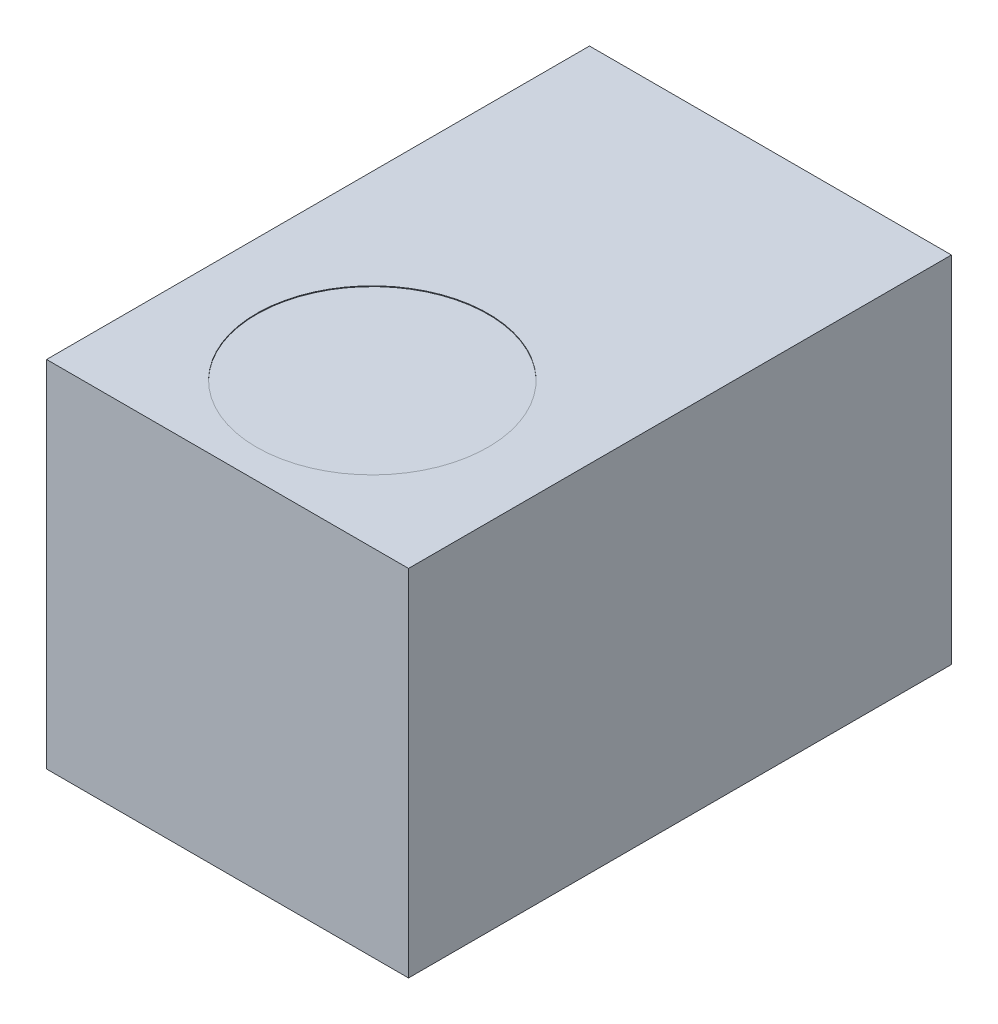
ISO-10303-21;
HEADER;
FILE_DESCRIPTION(('STEP AP214'),'2;1');
FILE_NAME('part.step','',(''),(''),'','','');
FILE_SCHEMA(('AUTOMOTIVE_DESIGN { 1 0 10303 214 1 1 1 1 }'));
ENDSEC;
DATA;
#1=APPLICATION_CONTEXT('core data for automotive mechanical design processes');
#2=APPLICATION_PROTOCOL_DEFINITION('international standard','automotive_design',2000,#1);
#3=PRODUCT_CONTEXT('',#1,'mechanical');
#4=PRODUCT('Part','Part','',(#3));
#5=PRODUCT_RELATED_PRODUCT_CATEGORY('part','',(#4));
#6=PRODUCT_DEFINITION_FORMATION('','',#4);
#7=PRODUCT_DEFINITION_CONTEXT('part definition',#1,'design');
#8=PRODUCT_DEFINITION('design','',#6,#7);
#9=PRODUCT_DEFINITION_SHAPE('','',#8);
#10=(LENGTH_UNIT() NAMED_UNIT(*) SI_UNIT(.MILLI.,.METRE.));
#11=(NAMED_UNIT(*) PLANE_ANGLE_UNIT() SI_UNIT($,.RADIAN.));
#12=(NAMED_UNIT(*) SI_UNIT($,.STERADIAN.) SOLID_ANGLE_UNIT());
#13=UNCERTAINTY_MEASURE_WITH_UNIT(LENGTH_MEASURE(1.E-05),#10,'distance_accuracy_value','');
#14=(GEOMETRIC_REPRESENTATION_CONTEXT(3) GLOBAL_UNCERTAINTY_ASSIGNED_CONTEXT((#13)) GLOBAL_UNIT_ASSIGNED_CONTEXT((#10,
#11,#12)) REPRESENTATION_CONTEXT('',''));
#15=CARTESIAN_POINT('',(0.,0.,0.));
#16=DIRECTION('',(0.,0.,1.));
#17=DIRECTION('',(1.,0.,0.));
#18=AXIS2_PLACEMENT_3D('',#15,#16,#17);
#19=CARTESIAN_POINT('',(50.,24.5,-37.5));
#20=DIRECTION('',(0.,0.,1.));
#21=DIRECTION('',(1.,0.,0.));
#22=AXIS2_PLACEMENT_3D('',#19,#20,#21);
#23=PLANE('',#22);
#24=DIRECTION('',(0.,1.,0.));
#25=VECTOR('',#24,1.);
#26=CARTESIAN_POINT('',(0.,24.5,-37.5));
#27=LINE('',#26,#25);
#28=CARTESIAN_POINT('',(0.,-24.5,-37.5));
#29=VERTEX_POINT('',#28);
#30=CARTESIAN_POINT('',(0.,24.5,-37.5));
#31=VERTEX_POINT('',#30);
#32=EDGE_CURVE('E163',#29,#31,#27,.T.);
#33=ORIENTED_EDGE('',*,*,#32,.T.);
#34=DIRECTION('',(-1.,0.,0.));
#35=VECTOR('',#34,1.);
#36=CARTESIAN_POINT('',(50.,24.5,-37.5));
#37=LINE('',#36,#35);
#38=CARTESIAN_POINT('',(50.,24.5,-37.5));
#39=VERTEX_POINT('',#38);
#40=EDGE_CURVE('E11',#39,#31,#37,.T.);
#41=ORIENTED_EDGE('',*,*,#40,.F.);
#42=DIRECTION('',(0.,1.,0.));
#43=VECTOR('',#42,1.);
#44=CARTESIAN_POINT('',(50.,24.5,-37.5));
#45=LINE('',#44,#43);
#46=CARTESIAN_POINT('',(50.,-24.5,-37.5));
#47=VERTEX_POINT('',#46);
#48=EDGE_CURVE('E169',#47,#39,#45,.T.);
#49=ORIENTED_EDGE('',*,*,#48,.F.);
#50=DIRECTION('',(-1.,0.,0.));
#51=VECTOR('',#50,1.);
#52=CARTESIAN_POINT('',(50.,-24.5,-37.5));
#53=LINE('',#52,#51);
#54=EDGE_CURVE('E179',#47,#29,#53,.T.);
#55=ORIENTED_EDGE('',*,*,#54,.T.);
#56=EDGE_LOOP('',(#33,#41,#49,#55));
#57=FACE_BOUND('',#56,.T.);
#58=ADVANCED_FACE('F40',(#57),#23,.F.);
#59=CARTESIAN_POINT('',(50.,24.5,37.5));
#60=DIRECTION('',(0.,-1.,0.));
#61=DIRECTION('',(0.,0.,-1.));
#62=AXIS2_PLACEMENT_3D('',#59,#60,#61);
#63=PLANE('',#62);
#64=CARTESIAN_POINT('',(25.,24.5,17.5));
#65=DIRECTION('',(0.,1.,0.));
#66=DIRECTION('',(0.,0.,1.));
#67=AXIS2_PLACEMENT_3D('',#64,#65,#66);
#68=CIRCLE('',#67,16.);
#69=CARTESIAN_POINT('',(25.,24.5,33.5));
#70=VERTEX_POINT('',#69);
#71=EDGE_CURVE('E144',#70,#70,#68,.T.);
#72=ORIENTED_EDGE('',*,*,#71,.F.);
#73=EDGE_LOOP('',(#72));
#74=FACE_BOUND('',#73,.T.);
#75=DIRECTION('',(0.,0.,1.));
#76=VECTOR('',#75,1.);
#77=CARTESIAN_POINT('',(0.,24.5,37.5));
#78=LINE('',#77,#76);
#79=CARTESIAN_POINT('',(0.,24.5,37.5));
#80=VERTEX_POINT('',#79);
#81=EDGE_CURVE('E183',#31,#80,#78,.T.);
#82=ORIENTED_EDGE('',*,*,#81,.T.);
#83=DIRECTION('',(-1.,0.,0.));
#84=VECTOR('',#83,1.);
#85=CARTESIAN_POINT('',(50.,24.5,37.5));
#86=LINE('',#85,#84);
#87=CARTESIAN_POINT('',(50.,24.5,37.5));
#88=VERTEX_POINT('',#87);
#89=EDGE_CURVE('E48',#88,#80,#86,.T.);
#90=ORIENTED_EDGE('',*,*,#89,.F.);
#91=DIRECTION('',(0.,0.,1.));
#92=VECTOR('',#91,1.);
#93=CARTESIAN_POINT('',(50.,24.5,37.5));
#94=LINE('',#93,#92);
#95=EDGE_CURVE('E92',#39,#88,#94,.T.);
#96=ORIENTED_EDGE('',*,*,#95,.F.);
#97=ORIENTED_EDGE('',*,*,#40,.T.);
#98=EDGE_LOOP('',(#82,#90,#96,#97));
#99=FACE_BOUND('',#98,.T.);
#100=ADVANCED_FACE('F218',(#74,#99),#63,.F.);
#101=CARTESIAN_POINT('',(50.,24.5,37.5));
#102=DIRECTION('',(0.,0.,-1.));
#103=DIRECTION('',(0.,1.,0.));
#104=AXIS2_PLACEMENT_3D('',#101,#102,#103);
#105=PLANE('',#104);
#106=DIRECTION('',(0.,-1.,0.));
#107=VECTOR('',#106,1.);
#108=CARTESIAN_POINT('',(0.,24.5,37.5));
#109=LINE('',#108,#107);
#110=CARTESIAN_POINT('',(0.,-24.5,37.5));
#111=VERTEX_POINT('',#110);
#112=EDGE_CURVE('E186',#80,#111,#109,.T.);
#113=ORIENTED_EDGE('',*,*,#112,.T.);
#114=DIRECTION('',(-1.,0.,0.));
#115=VECTOR('',#114,1.);
#116=CARTESIAN_POINT('',(50.,-24.5,37.5));
#117=LINE('',#116,#115);
#118=CARTESIAN_POINT('',(50.,-24.5,37.5));
#119=VERTEX_POINT('',#118);
#120=EDGE_CURVE('E193',#119,#111,#117,.T.);
#121=ORIENTED_EDGE('',*,*,#120,.F.);
#122=DIRECTION('',(0.,-1.,0.));
#123=VECTOR('',#122,1.);
#124=CARTESIAN_POINT('',(50.,24.5,37.5));
#125=LINE('',#124,#123);
#126=EDGE_CURVE('E174',#88,#119,#125,.T.);
#127=ORIENTED_EDGE('',*,*,#126,.F.);
#128=ORIENTED_EDGE('',*,*,#89,.T.);
#129=EDGE_LOOP('',(#113,#121,#127,#128));
#130=FACE_BOUND('',#129,.T.);
#131=ADVANCED_FACE('F200',(#130),#105,.F.);
#132=CARTESIAN_POINT('',(50.,-24.5,37.5));
#133=DIRECTION('',(0.,1.,0.));
#134=DIRECTION('',(0.,0.,1.));
#135=AXIS2_PLACEMENT_3D('',#132,#133,#134);
#136=PLANE('',#135);
#137=DIRECTION('',(1.,0.,0.));
#138=VECTOR('',#137,1.);
#139=CARTESIAN_POINT('',(4.99999999999999,-24.5,-16.5));
#140=LINE('',#139,#138);
#141=CARTESIAN_POINT('',(4.99999999999999,-24.5,-16.5));
#142=VERTEX_POINT('',#141);
#143=CARTESIAN_POINT('',(45.,-24.5,-16.5));
#144=VERTEX_POINT('',#143);
#145=EDGE_CURVE('E153',#142,#144,#140,.T.);
#146=ORIENTED_EDGE('',*,*,#145,.F.);
#147=DIRECTION('',(0.,0.,-1.));
#148=VECTOR('',#147,1.);
#149=CARTESIAN_POINT('',(5.,-24.5,35.5));
#150=LINE('',#149,#148);
#151=CARTESIAN_POINT('',(5.,-24.5,35.5));
#152=VERTEX_POINT('',#151);
#153=EDGE_CURVE('E55',#152,#142,#150,.T.);
#154=ORIENTED_EDGE('',*,*,#153,.F.);
#155=DIRECTION('',(-1.,0.,0.));
#156=VECTOR('',#155,1.);
#157=CARTESIAN_POINT('',(5.,-24.5,35.5));
#158=LINE('',#157,#156);
#159=CARTESIAN_POINT('',(45.,-24.5,35.5));
#160=VERTEX_POINT('',#159);
#161=EDGE_CURVE('E137',#160,#152,#158,.T.);
#162=ORIENTED_EDGE('',*,*,#161,.F.);
#163=DIRECTION('',(0.,0.,1.));
#164=VECTOR('',#163,1.);
#165=CARTESIAN_POINT('',(45.,-24.5,35.5));
#166=LINE('',#165,#164);
#167=EDGE_CURVE('E141',#144,#160,#166,.T.);
#168=ORIENTED_EDGE('',*,*,#167,.F.);
#169=EDGE_LOOP('',(#146,#154,#162,#168));
#170=FACE_BOUND('',#169,.T.);
#171=DIRECTION('',(0.,0.,-1.));
#172=VECTOR('',#171,1.);
#173=CARTESIAN_POINT('',(0.,-24.5,37.5));
#174=LINE('',#173,#172);
#175=EDGE_CURVE('E85',#111,#29,#174,.T.);
#176=ORIENTED_EDGE('',*,*,#175,.T.);
#177=ORIENTED_EDGE('',*,*,#54,.F.);
#178=DIRECTION('',(0.,0.,-1.));
#179=VECTOR('',#178,1.);
#180=CARTESIAN_POINT('',(50.,-24.5,37.5));
#181=LINE('',#180,#179);
#182=EDGE_CURVE('E64',#119,#47,#181,.T.);
#183=ORIENTED_EDGE('',*,*,#182,.F.);
#184=ORIENTED_EDGE('',*,*,#120,.T.);
#185=EDGE_LOOP('',(#176,#177,#183,#184));
#186=FACE_BOUND('',#185,.T.);
#187=ADVANCED_FACE('F208',(#170,#186),#136,.F.);
#188=CARTESIAN_POINT('',(50.,0.,0.));
#189=DIRECTION('',(1.,0.,0.));
#190=DIRECTION('',(0.,0.,-1.));
#191=AXIS2_PLACEMENT_3D('',#188,#189,#190);
#192=PLANE('',#191);
#193=ORIENTED_EDGE('',*,*,#48,.T.);
#194=ORIENTED_EDGE('',*,*,#95,.T.);
#195=ORIENTED_EDGE('',*,*,#126,.T.);
#196=ORIENTED_EDGE('',*,*,#182,.T.);
#197=EDGE_LOOP('',(#193,#194,#195,#196));
#198=FACE_BOUND('',#197,.T.);
#199=ADVANCED_FACE('F210',(#198),#192,.T.);
#200=CARTESIAN_POINT('',(0.,0.,0.));
#201=DIRECTION('',(1.,0.,0.));
#202=DIRECTION('',(0.,0.,-1.));
#203=AXIS2_PLACEMENT_3D('',#200,#201,#202);
#204=PLANE('',#203);
#205=ORIENTED_EDGE('',*,*,#32,.F.);
#206=ORIENTED_EDGE('',*,*,#175,.F.);
#207=ORIENTED_EDGE('',*,*,#112,.F.);
#208=ORIENTED_EDGE('',*,*,#81,.F.);
#209=EDGE_LOOP('',(#205,#206,#207,#208));
#210=FACE_BOUND('',#209,.T.);
#211=ADVANCED_FACE('F204',(#210),#204,.F.);
#212=CARTESIAN_POINT('',(5.,15.5,35.5));
#213=DIRECTION('',(-1.,0.,0.));
#214=DIRECTION('',(0.,0.,1.));
#215=AXIS2_PLACEMENT_3D('',#212,#213,#214);
#216=PLANE('',#215);
#217=ORIENTED_EDGE('',*,*,#153,.T.);
#218=DIRECTION('',(0.,-1.,0.));
#219=VECTOR('',#218,1.);
#220=CARTESIAN_POINT('',(4.99999999999999,15.5,-16.5));
#221=LINE('',#220,#219);
#222=CARTESIAN_POINT('',(4.99999999999999,15.5,-16.5));
#223=VERTEX_POINT('',#222);
#224=EDGE_CURVE('E112',#223,#142,#221,.T.);
#225=ORIENTED_EDGE('',*,*,#224,.F.);
#226=DIRECTION('',(0.,0.,-1.));
#227=VECTOR('',#226,1.);
#228=CARTESIAN_POINT('',(5.,15.5,35.5));
#229=LINE('',#228,#227);
#230=CARTESIAN_POINT('',(5.,15.5,35.5));
#231=VERTEX_POINT('',#230);
#232=EDGE_CURVE('E116',#231,#223,#229,.T.);
#233=ORIENTED_EDGE('',*,*,#232,.F.);
#234=DIRECTION('',(0.,-1.,0.));
#235=VECTOR('',#234,1.);
#236=CARTESIAN_POINT('',(5.,15.5,35.5));
#237=LINE('',#236,#235);
#238=EDGE_CURVE('E160',#231,#152,#237,.T.);
#239=ORIENTED_EDGE('',*,*,#238,.T.);
#240=EDGE_LOOP('',(#217,#225,#233,#239));
#241=FACE_BOUND('',#240,.T.);
#242=ADVANCED_FACE('F114',(#241),#216,.F.);
#243=CARTESIAN_POINT('',(5.,15.5,35.5));
#244=DIRECTION('',(0.,0.,1.));
#245=DIRECTION('',(1.,0.,0.));
#246=AXIS2_PLACEMENT_3D('',#243,#244,#245);
#247=PLANE('',#246);
#248=ORIENTED_EDGE('',*,*,#161,.T.);
#249=ORIENTED_EDGE('',*,*,#238,.F.);
#250=DIRECTION('',(-1.,0.,0.));
#251=VECTOR('',#250,1.);
#252=CARTESIAN_POINT('',(5.,15.5,35.5));
#253=LINE('',#252,#251);
#254=CARTESIAN_POINT('',(45.,15.5,35.5));
#255=VERTEX_POINT('',#254);
#256=EDGE_CURVE('E123',#255,#231,#253,.T.);
#257=ORIENTED_EDGE('',*,*,#256,.F.);
#258=DIRECTION('',(0.,-1.,0.));
#259=VECTOR('',#258,1.);
#260=CARTESIAN_POINT('',(45.,15.5,35.5));
#261=LINE('',#260,#259);
#262=EDGE_CURVE('E164',#255,#160,#261,.T.);
#263=ORIENTED_EDGE('',*,*,#262,.T.);
#264=EDGE_LOOP('',(#248,#249,#257,#263));
#265=FACE_BOUND('',#264,.T.);
#266=ADVANCED_FACE('F248',(#265),#247,.F.);
#267=CARTESIAN_POINT('',(45.,15.5,35.5));
#268=DIRECTION('',(1.,0.,0.));
#269=DIRECTION('',(0.,0.,-1.));
#270=AXIS2_PLACEMENT_3D('',#267,#268,#269);
#271=PLANE('',#270);
#272=ORIENTED_EDGE('',*,*,#167,.T.);
#273=ORIENTED_EDGE('',*,*,#262,.F.);
#274=DIRECTION('',(0.,0.,1.));
#275=VECTOR('',#274,1.);
#276=CARTESIAN_POINT('',(45.,15.5,35.5));
#277=LINE('',#276,#275);
#278=CARTESIAN_POINT('',(45.,15.5,-16.5));
#279=VERTEX_POINT('',#278);
#280=EDGE_CURVE('E132',#279,#255,#277,.T.);
#281=ORIENTED_EDGE('',*,*,#280,.F.);
#282=DIRECTION('',(0.,-1.,0.));
#283=VECTOR('',#282,1.);
#284=CARTESIAN_POINT('',(45.,15.5,-16.5));
#285=LINE('',#284,#283);
#286=EDGE_CURVE('E122',#279,#144,#285,.T.);
#287=ORIENTED_EDGE('',*,*,#286,.T.);
#288=EDGE_LOOP('',(#272,#273,#281,#287));
#289=FACE_BOUND('',#288,.T.);
#290=ADVANCED_FACE('F251',(#289),#271,.F.);
#291=CARTESIAN_POINT('',(4.99999999999999,15.5,-16.5));
#292=DIRECTION('',(0.,0.,-1.));
#293=DIRECTION('',(-1.,0.,0.));
#294=AXIS2_PLACEMENT_3D('',#291,#292,#293);
#295=PLANE('',#294);
#296=ORIENTED_EDGE('',*,*,#145,.T.);
#297=ORIENTED_EDGE('',*,*,#286,.F.);
#298=DIRECTION('',(1.,0.,0.));
#299=VECTOR('',#298,1.);
#300=CARTESIAN_POINT('',(4.99999999999999,15.5,-16.5));
#301=LINE('',#300,#299);
#302=EDGE_CURVE('E126',#223,#279,#301,.T.);
#303=ORIENTED_EDGE('',*,*,#302,.F.);
#304=ORIENTED_EDGE('',*,*,#224,.T.);
#305=EDGE_LOOP('',(#296,#297,#303,#304));
#306=FACE_BOUND('',#305,.T.);
#307=ADVANCED_FACE('F127',(#306),#295,.F.);
#308=CARTESIAN_POINT('',(0.,15.5,0.));
#309=DIRECTION('',(0.,-1.,0.));
#310=DIRECTION('',(0.,0.,-1.));
#311=AXIS2_PLACEMENT_3D('',#308,#309,#310);
#312=PLANE('',#311);
#313=ORIENTED_EDGE('',*,*,#232,.T.);
#314=ORIENTED_EDGE('',*,*,#302,.T.);
#315=ORIENTED_EDGE('',*,*,#280,.T.);
#316=ORIENTED_EDGE('',*,*,#256,.T.);
#317=EDGE_LOOP('',(#313,#314,#315,#316));
#318=FACE_BOUND('',#317,.T.);
#319=ADVANCED_FACE('F134',(#318),#312,.T.);
#320=CARTESIAN_POINT('',(25.,24.4,17.5));
#321=DIRECTION('',(0.,1.,0.));
#322=DIRECTION('',(0.,0.,1.));
#323=AXIS2_PLACEMENT_3D('',#320,#321,#322);
#324=CYLINDRICAL_SURFACE('',#323,16.);
#325=CARTESIAN_POINT('',(25.,24.4,17.5));
#326=DIRECTION('',(0.,1.,0.));
#327=DIRECTION('',(0.,0.,1.));
#328=AXIS2_PLACEMENT_3D('',#325,#326,#327);
#329=CIRCLE('',#328,16.);
#330=CARTESIAN_POINT('',(25.,24.4,33.5));
#331=VERTEX_POINT('',#330);
#332=EDGE_CURVE('E154',#331,#331,#329,.T.);
#333=ORIENTED_EDGE('',*,*,#332,.F.);
#334=EDGE_LOOP('',(#333));
#335=FACE_BOUND('',#334,.T.);
#336=ORIENTED_EDGE('',*,*,#71,.T.);
#337=EDGE_LOOP('',(#336));
#338=FACE_BOUND('',#337,.T.);
#339=ADVANCED_FACE('F238',(#335,#338),#324,.F.);
#340=CARTESIAN_POINT('',(25.,24.4,17.5));
#341=DIRECTION('',(0.,1.,0.));
#342=DIRECTION('',(0.,0.,1.));
#343=AXIS2_PLACEMENT_3D('',#340,#341,#342);
#344=PLANE('',#343);
#345=ORIENTED_EDGE('',*,*,#332,.T.);
#346=EDGE_LOOP('',(#345));
#347=FACE_BOUND('',#346,.T.);
#348=ADVANCED_FACE('F236',(#347),#344,.T.);
#349=CLOSED_SHELL('',(#58,#100,#131,#187,#199,#211,#242,#266,#290,#307,#319,#339,#348));
#350=MANIFOLD_SOLID_BREP('B2',#349);
#351=ADVANCED_BREP_SHAPE_REPRESENTATION('',(#18,#350),#14);
#352=SHAPE_DEFINITION_REPRESENTATION(#9,#351);
ENDSEC;
END-ISO-10303-21;
